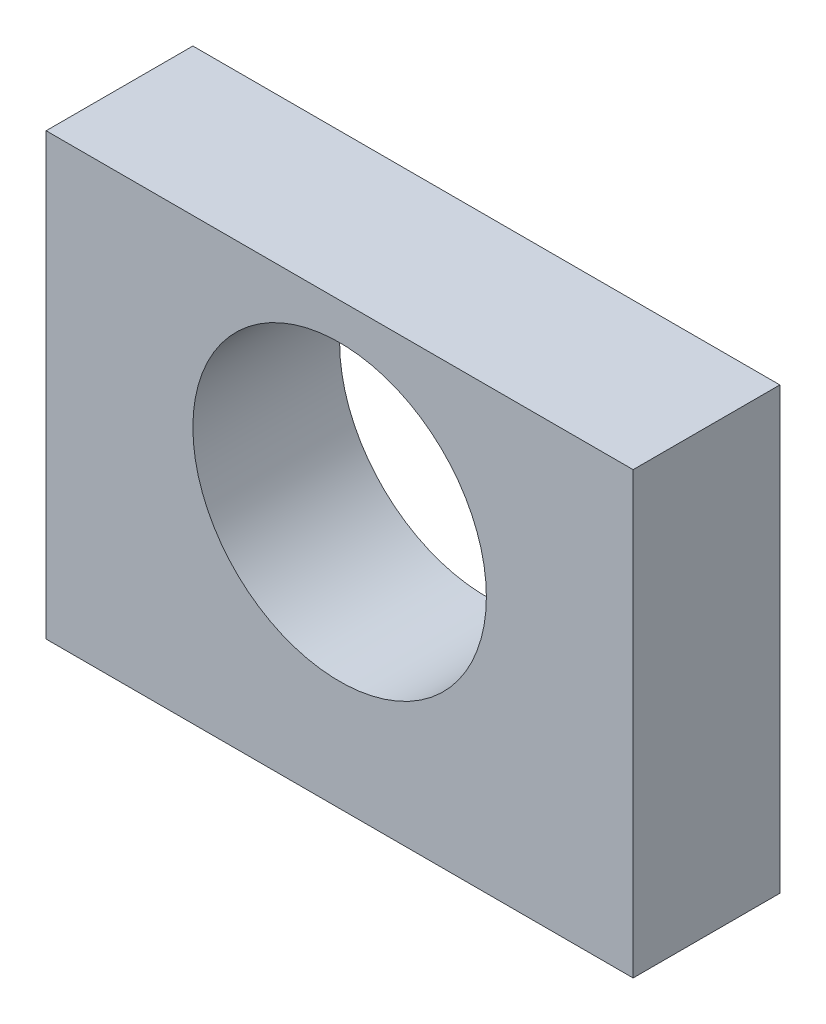
ISO-10303-21;
HEADER;
FILE_DESCRIPTION(('STEP AP214'),'2;1');
FILE_NAME('part.step','',(''),(''),'','','');
FILE_SCHEMA(('AUTOMOTIVE_DESIGN { 1 0 10303 214 1 1 1 1 }'));
ENDSEC;
DATA;
#1=APPLICATION_CONTEXT('core data for automotive mechanical design processes');
#2=APPLICATION_PROTOCOL_DEFINITION('international standard','automotive_design',2000,#1);
#3=PRODUCT_CONTEXT('',#1,'mechanical');
#4=PRODUCT('Part','Part','',(#3));
#5=PRODUCT_RELATED_PRODUCT_CATEGORY('part','',(#4));
#6=PRODUCT_DEFINITION_FORMATION('','',#4);
#7=PRODUCT_DEFINITION_CONTEXT('part definition',#1,'design');
#8=PRODUCT_DEFINITION('design','',#6,#7);
#9=PRODUCT_DEFINITION_SHAPE('','',#8);
#10=(LENGTH_UNIT() NAMED_UNIT(*) SI_UNIT(.MILLI.,.METRE.));
#11=(NAMED_UNIT(*) PLANE_ANGLE_UNIT() SI_UNIT($,.RADIAN.));
#12=(NAMED_UNIT(*) SI_UNIT($,.STERADIAN.) SOLID_ANGLE_UNIT());
#13=UNCERTAINTY_MEASURE_WITH_UNIT(LENGTH_MEASURE(1.E-05),#10,'distance_accuracy_value','');
#14=(GEOMETRIC_REPRESENTATION_CONTEXT(3) GLOBAL_UNCERTAINTY_ASSIGNED_CONTEXT((#13)) GLOBAL_UNIT_ASSIGNED_CONTEXT((#10,
#11,#12)) REPRESENTATION_CONTEXT('',''));
#15=CARTESIAN_POINT('',(0.,0.,0.));
#16=DIRECTION('',(0.,0.,1.));
#17=DIRECTION('',(1.,0.,0.));
#18=AXIS2_PLACEMENT_3D('',#15,#16,#17);
#19=CARTESIAN_POINT('',(-5.08,-0.2,0.));
#20=DIRECTION('',(0.,0.,-1.));
#21=DIRECTION('',(1.,0.,0.));
#22=AXIS2_PLACEMENT_3D('',#19,#20,#21);
#23=CYLINDRICAL_SURFACE('',#22,0.4);
#24=CARTESIAN_POINT('',(-5.08,-0.2,-0.2));
#25=DIRECTION('',(0.,0.,1.));
#26=DIRECTION('',(1.,0.,0.));
#27=AXIS2_PLACEMENT_3D('',#24,#25,#26);
#28=CIRCLE('',#27,0.4);
#29=CARTESIAN_POINT('',(-5.48,-0.2,-0.2));
#30=VERTEX_POINT('',#29);
#31=EDGE_CURVE('E39',#30,#30,#28,.T.);
#32=ORIENTED_EDGE('',*,*,#31,.F.);
#33=EDGE_LOOP('',(#32));
#34=FACE_BOUND('',#33,.T.);
#35=CARTESIAN_POINT('',(-5.08,-0.2,0.2));
#36=DIRECTION('',(0.,0.,-1.));
#37=DIRECTION('',(1.,0.,0.));
#38=AXIS2_PLACEMENT_3D('',#35,#36,#37);
#39=CIRCLE('',#38,0.4);
#40=CARTESIAN_POINT('',(-5.48,-0.2,0.2));
#41=VERTEX_POINT('',#40);
#42=EDGE_CURVE('E125',#41,#41,#39,.T.);
#43=ORIENTED_EDGE('',*,*,#42,.F.);
#44=EDGE_LOOP('',(#43));
#45=FACE_BOUND('',#44,.T.);
#46=ADVANCED_FACE('F16',(#34,#45),#23,.F.);
#47=CARTESIAN_POINT('',(-5.08,-0.3,0.2));
#48=DIRECTION('',(0.,0.,1.));
#49=DIRECTION('',(1.,0.,0.));
#50=AXIS2_PLACEMENT_3D('',#47,#48,#49);
#51=PLANE('',#50);
#52=DIRECTION('',(0.,1.,0.));
#53=VECTOR('',#52,1.);
#54=CARTESIAN_POINT('',(-4.28,-0.3,0.2));
#55=LINE('',#54,#53);
#56=CARTESIAN_POINT('',(-4.28,-0.9,0.2));
#57=VERTEX_POINT('',#56);
#58=CARTESIAN_POINT('',(-4.28,0.3,0.2));
#59=VERTEX_POINT('',#58);
#60=EDGE_CURVE('E11',#57,#59,#55,.T.);
#61=ORIENTED_EDGE('',*,*,#60,.T.);
#62=DIRECTION('',(-1.,0.,0.));
#63=VECTOR('',#62,1.);
#64=CARTESIAN_POINT('',(-5.08,0.3,0.2));
#65=LINE('',#64,#63);
#66=CARTESIAN_POINT('',(-5.88,0.3,0.2));
#67=VERTEX_POINT('',#66);
#68=EDGE_CURVE('E27',#59,#67,#65,.T.);
#69=ORIENTED_EDGE('',*,*,#68,.T.);
#70=DIRECTION('',(0.,-1.,0.));
#71=VECTOR('',#70,1.);
#72=CARTESIAN_POINT('',(-5.88,-0.3,0.2));
#73=LINE('',#72,#71);
#74=CARTESIAN_POINT('',(-5.88,-0.9,0.2));
#75=VERTEX_POINT('',#74);
#76=EDGE_CURVE('E64',#67,#75,#73,.T.);
#77=ORIENTED_EDGE('',*,*,#76,.T.);
#78=DIRECTION('',(1.,0.,0.));
#79=VECTOR('',#78,1.);
#80=CARTESIAN_POINT('',(-5.08,-0.9,0.2));
#81=LINE('',#80,#79);
#82=EDGE_CURVE('E75',#75,#57,#81,.T.);
#83=ORIENTED_EDGE('',*,*,#82,.T.);
#84=EDGE_LOOP('',(#61,#69,#77,#83));
#85=FACE_BOUND('',#84,.T.);
#86=ORIENTED_EDGE('',*,*,#42,.T.);
#87=EDGE_LOOP('',(#86));
#88=FACE_BOUND('',#87,.T.);
#89=ADVANCED_FACE('F138',(#85,#88),#51,.T.);
#90=CARTESIAN_POINT('',(-5.08,-0.3,-0.2));
#91=DIRECTION('',(0.,0.,1.));
#92=DIRECTION('',(1.,0.,0.));
#93=AXIS2_PLACEMENT_3D('',#90,#91,#92);
#94=PLANE('',#93);
#95=DIRECTION('',(0.,-1.,0.));
#96=VECTOR('',#95,1.);
#97=CARTESIAN_POINT('',(-4.28,-0.3,-0.2));
#98=LINE('',#97,#96);
#99=CARTESIAN_POINT('',(-4.28,0.3,-0.2));
#100=VERTEX_POINT('',#99);
#101=CARTESIAN_POINT('',(-4.28,-0.9,-0.2));
#102=VERTEX_POINT('',#101);
#103=EDGE_CURVE('E102',#100,#102,#98,.T.);
#104=ORIENTED_EDGE('',*,*,#103,.T.);
#105=DIRECTION('',(-1.,0.,0.));
#106=VECTOR('',#105,1.);
#107=CARTESIAN_POINT('',(-5.08,-0.9,-0.2));
#108=LINE('',#107,#106);
#109=CARTESIAN_POINT('',(-5.88,-0.9,-0.2));
#110=VERTEX_POINT('',#109);
#111=EDGE_CURVE('E20',#102,#110,#108,.T.);
#112=ORIENTED_EDGE('',*,*,#111,.T.);
#113=DIRECTION('',(0.,1.,0.));
#114=VECTOR('',#113,1.);
#115=CARTESIAN_POINT('',(-5.88,-0.3,-0.2));
#116=LINE('',#115,#114);
#117=CARTESIAN_POINT('',(-5.88,0.3,-0.2));
#118=VERTEX_POINT('',#117);
#119=EDGE_CURVE('E88',#110,#118,#116,.T.);
#120=ORIENTED_EDGE('',*,*,#119,.T.);
#121=DIRECTION('',(1.,0.,0.));
#122=VECTOR('',#121,1.);
#123=CARTESIAN_POINT('',(-5.08,0.3,-0.2));
#124=LINE('',#123,#122);
#125=EDGE_CURVE('E96',#118,#100,#124,.T.);
#126=ORIENTED_EDGE('',*,*,#125,.T.);
#127=EDGE_LOOP('',(#104,#112,#120,#126));
#128=FACE_BOUND('',#127,.T.);
#129=ORIENTED_EDGE('',*,*,#31,.T.);
#130=EDGE_LOOP('',(#129));
#131=FACE_BOUND('',#130,.T.);
#132=ADVANCED_FACE('F99',(#128,#131),#94,.F.);
#133=CARTESIAN_POINT('',(-5.08,-0.9,0.));
#134=DIRECTION('',(0.,1.,0.));
#135=DIRECTION('',(1.,0.,0.));
#136=AXIS2_PLACEMENT_3D('',#133,#134,#135);
#137=PLANE('',#136);
#138=DIRECTION('',(0.,0.,-1.));
#139=VECTOR('',#138,1.);
#140=CARTESIAN_POINT('',(-5.88,-0.9,0.));
#141=LINE('',#140,#139);
#142=EDGE_CURVE('E91',#75,#110,#141,.T.);
#143=ORIENTED_EDGE('',*,*,#142,.T.);
#144=ORIENTED_EDGE('',*,*,#111,.F.);
#145=DIRECTION('',(0.,0.,-1.));
#146=VECTOR('',#145,1.);
#147=CARTESIAN_POINT('',(-4.28,-0.9,0.));
#148=LINE('',#147,#146);
#149=EDGE_CURVE('E127',#57,#102,#148,.T.);
#150=ORIENTED_EDGE('',*,*,#149,.F.);
#151=ORIENTED_EDGE('',*,*,#82,.F.);
#152=EDGE_LOOP('',(#143,#144,#150,#151));
#153=FACE_BOUND('',#152,.T.);
#154=ADVANCED_FACE('F105',(#153),#137,.F.);
#155=CARTESIAN_POINT('',(-5.88,-0.3,0.));
#156=DIRECTION('',(1.,0.,0.));
#157=DIRECTION('',(0.,1.,0.));
#158=AXIS2_PLACEMENT_3D('',#155,#156,#157);
#159=PLANE('',#158);
#160=DIRECTION('',(0.,0.,-1.));
#161=VECTOR('',#160,1.);
#162=CARTESIAN_POINT('',(-5.88,0.3,0.));
#163=LINE('',#162,#161);
#164=EDGE_CURVE('E93',#67,#118,#163,.T.);
#165=ORIENTED_EDGE('',*,*,#164,.T.);
#166=ORIENTED_EDGE('',*,*,#119,.F.);
#167=ORIENTED_EDGE('',*,*,#142,.F.);
#168=ORIENTED_EDGE('',*,*,#76,.F.);
#169=EDGE_LOOP('',(#165,#166,#167,#168));
#170=FACE_BOUND('',#169,.T.);
#171=ADVANCED_FACE('F90',(#170),#159,.F.);
#172=CARTESIAN_POINT('',(-5.08,0.3,0.));
#173=DIRECTION('',(0.,-1.,0.));
#174=DIRECTION('',(0.,0.,-1.));
#175=AXIS2_PLACEMENT_3D('',#172,#173,#174);
#176=PLANE('',#175);
#177=DIRECTION('',(0.,0.,-1.));
#178=VECTOR('',#177,1.);
#179=CARTESIAN_POINT('',(-4.28,0.3,0.));
#180=LINE('',#179,#178);
#181=EDGE_CURVE('E116',#59,#100,#180,.T.);
#182=ORIENTED_EDGE('',*,*,#181,.T.);
#183=ORIENTED_EDGE('',*,*,#125,.F.);
#184=ORIENTED_EDGE('',*,*,#164,.F.);
#185=ORIENTED_EDGE('',*,*,#68,.F.);
#186=EDGE_LOOP('',(#182,#183,#184,#185));
#187=FACE_BOUND('',#186,.T.);
#188=ADVANCED_FACE('F137',(#187),#176,.F.);
#189=CARTESIAN_POINT('',(-4.28,-0.3,0.));
#190=DIRECTION('',(-1.,0.,0.));
#191=DIRECTION('',(0.,0.,1.));
#192=AXIS2_PLACEMENT_3D('',#189,#190,#191);
#193=PLANE('',#192);
#194=ORIENTED_EDGE('',*,*,#149,.T.);
#195=ORIENTED_EDGE('',*,*,#103,.F.);
#196=ORIENTED_EDGE('',*,*,#181,.F.);
#197=ORIENTED_EDGE('',*,*,#60,.F.);
#198=EDGE_LOOP('',(#194,#195,#196,#197));
#199=FACE_BOUND('',#198,.T.);
#200=ADVANCED_FACE('F18',(#199),#193,.F.);
#201=CLOSED_SHELL('',(#46,#89,#132,#154,#171,#188,#200));
#202=MANIFOLD_SOLID_BREP('B1',#201);
#203=ADVANCED_BREP_SHAPE_REPRESENTATION('',(#18,#202),#14);
#204=SHAPE_DEFINITION_REPRESENTATION(#9,#203);
ENDSEC;
END-ISO-10303-21;
